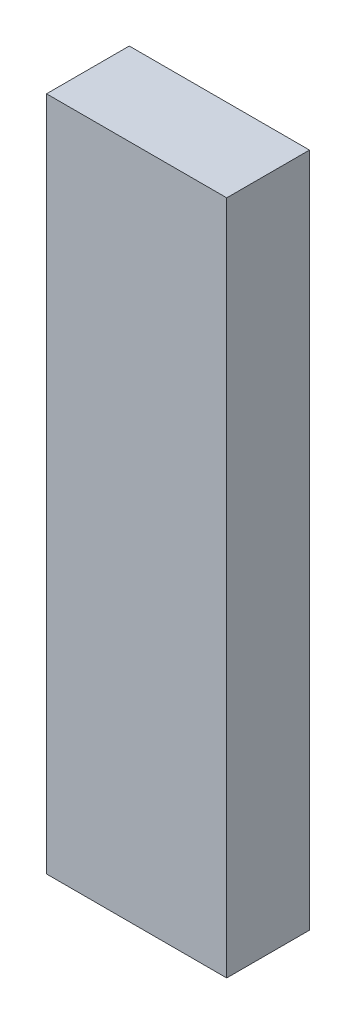
ISO-10303-21;
HEADER;
FILE_DESCRIPTION(('STEP AP214'),'2;1');
FILE_NAME('part.step','',(''),(''),'','','');
FILE_SCHEMA(('AUTOMOTIVE_DESIGN { 1 0 10303 214 1 1 1 1 }'));
ENDSEC;
DATA;
#1=APPLICATION_CONTEXT('core data for automotive mechanical design processes');
#2=APPLICATION_PROTOCOL_DEFINITION('international standard','automotive_design',2000,#1);
#3=PRODUCT_CONTEXT('',#1,'mechanical');
#4=PRODUCT('Part','Part','',(#3));
#5=PRODUCT_RELATED_PRODUCT_CATEGORY('part','',(#4));
#6=PRODUCT_DEFINITION_FORMATION('','',#4);
#7=PRODUCT_DEFINITION_CONTEXT('part definition',#1,'design');
#8=PRODUCT_DEFINITION('design','',#6,#7);
#9=PRODUCT_DEFINITION_SHAPE('','',#8);
#10=(LENGTH_UNIT() NAMED_UNIT(*) SI_UNIT(.MILLI.,.METRE.));
#11=(NAMED_UNIT(*) PLANE_ANGLE_UNIT() SI_UNIT($,.RADIAN.));
#12=(NAMED_UNIT(*) SI_UNIT($,.STERADIAN.) SOLID_ANGLE_UNIT());
#13=UNCERTAINTY_MEASURE_WITH_UNIT(LENGTH_MEASURE(1.E-05),#10,'distance_accuracy_value','');
#14=(GEOMETRIC_REPRESENTATION_CONTEXT(3) GLOBAL_UNCERTAINTY_ASSIGNED_CONTEXT((#13)) GLOBAL_UNIT_ASSIGNED_CONTEXT((#10,
#11,#12)) REPRESENTATION_CONTEXT('',''));
#15=CARTESIAN_POINT('',(0.,0.,0.));
#16=DIRECTION('',(0.,0.,1.));
#17=DIRECTION('',(1.,0.,0.));
#18=AXIS2_PLACEMENT_3D('',#15,#16,#17);
#19=CARTESIAN_POINT('',(0.76183998,-2.8575,0.));
#20=DIRECTION('',(0.,-1.,0.));
#21=DIRECTION('',(0.,0.,-1.));
#22=AXIS2_PLACEMENT_3D('',#19,#20,#21);
#23=PLANE('',#22);
#24=DIRECTION('',(0.,0.,1.));
#25=VECTOR('',#24,1.);
#26=CARTESIAN_POINT('',(0.76183998,-2.8575,0.));
#27=LINE('',#26,#25);
#28=CARTESIAN_POINT('',(0.76183998,-2.8575,0.));
#29=VERTEX_POINT('',#28);
#30=CARTESIAN_POINT('',(0.76183998,-2.8575,0.6999986));
#31=VERTEX_POINT('',#30);
#32=EDGE_CURVE('E11',#29,#31,#27,.T.);
#33=ORIENTED_EDGE('',*,*,#32,.T.);
#34=DIRECTION('',(-1.,0.,0.));
#35=VECTOR('',#34,1.);
#36=CARTESIAN_POINT('',(0.76183998,-2.8575,0.6999986));
#37=LINE('',#36,#35);
#38=CARTESIAN_POINT('',(-0.76216002,-2.8575,0.6999986));
#39=VERTEX_POINT('',#38);
#40=EDGE_CURVE('E28',#31,#39,#37,.T.);
#41=ORIENTED_EDGE('',*,*,#40,.T.);
#42=DIRECTION('',(0.,0.,1.));
#43=VECTOR('',#42,1.);
#44=CARTESIAN_POINT('',(-0.76216002,-2.8575,0.));
#45=LINE('',#44,#43);
#46=CARTESIAN_POINT('',(-0.76216002,-2.8575,0.));
#47=VERTEX_POINT('',#46);
#48=EDGE_CURVE('E90',#47,#39,#45,.T.);
#49=ORIENTED_EDGE('',*,*,#48,.F.);
#50=DIRECTION('',(-1.,0.,0.));
#51=VECTOR('',#50,1.);
#52=CARTESIAN_POINT('',(0.76183998,-2.8575,0.));
#53=LINE('',#52,#51);
#54=EDGE_CURVE('E21',#29,#47,#53,.T.);
#55=ORIENTED_EDGE('',*,*,#54,.F.);
#56=EDGE_LOOP('',(#33,#41,#49,#55));
#57=FACE_BOUND('',#56,.T.);
#58=ADVANCED_FACE('F17',(#57),#23,.T.);
#59=CARTESIAN_POINT('',(-0.76216002,-2.8575,0.));
#60=DIRECTION('',(-1.,0.,0.));
#61=DIRECTION('',(0.,0.,1.));
#62=AXIS2_PLACEMENT_3D('',#59,#60,#61);
#63=PLANE('',#62);
#64=ORIENTED_EDGE('',*,*,#48,.T.);
#65=DIRECTION('',(0.,1.,0.));
#66=VECTOR('',#65,1.);
#67=CARTESIAN_POINT('',(-0.76216002,-2.8575,0.6999986));
#68=LINE('',#67,#66);
#69=CARTESIAN_POINT('',(-0.76216002,2.8575,0.6999986));
#70=VERTEX_POINT('',#69);
#71=EDGE_CURVE('E94',#39,#70,#68,.T.);
#72=ORIENTED_EDGE('',*,*,#71,.T.);
#73=DIRECTION('',(0.,0.,1.));
#74=VECTOR('',#73,1.);
#75=CARTESIAN_POINT('',(-0.76216002,2.8575,0.));
#76=LINE('',#75,#74);
#77=CARTESIAN_POINT('',(-0.76216002,2.8575,0.));
#78=VERTEX_POINT('',#77);
#79=EDGE_CURVE('E97',#78,#70,#76,.T.);
#80=ORIENTED_EDGE('',*,*,#79,.F.);
#81=DIRECTION('',(0.,1.,0.));
#82=VECTOR('',#81,1.);
#83=CARTESIAN_POINT('',(-0.76216002,-2.8575,0.));
#84=LINE('',#83,#82);
#85=EDGE_CURVE('E77',#47,#78,#84,.T.);
#86=ORIENTED_EDGE('',*,*,#85,.F.);
#87=EDGE_LOOP('',(#64,#72,#80,#86));
#88=FACE_BOUND('',#87,.T.);
#89=ADVANCED_FACE('F96',(#88),#63,.T.);
#90=CARTESIAN_POINT('',(-0.76216002,2.8575,0.));
#91=DIRECTION('',(0.,1.,0.));
#92=DIRECTION('',(1.,0.,0.));
#93=AXIS2_PLACEMENT_3D('',#90,#91,#92);
#94=PLANE('',#93);
#95=ORIENTED_EDGE('',*,*,#79,.T.);
#96=DIRECTION('',(1.,0.,0.));
#97=VECTOR('',#96,1.);
#98=CARTESIAN_POINT('',(-0.76216002,2.8575,0.6999986));
#99=LINE('',#98,#97);
#100=CARTESIAN_POINT('',(0.76216256,2.8575,0.6999986));
#101=VERTEX_POINT('',#100);
#102=EDGE_CURVE('E104',#70,#101,#99,.T.);
#103=ORIENTED_EDGE('',*,*,#102,.T.);
#104=DIRECTION('',(0.,0.,1.));
#105=VECTOR('',#104,1.);
#106=CARTESIAN_POINT('',(0.76216256,2.8575,0.));
#107=LINE('',#106,#105);
#108=CARTESIAN_POINT('',(0.76216256,2.8575,0.));
#109=VERTEX_POINT('',#108);
#110=EDGE_CURVE('E70',#109,#101,#107,.T.);
#111=ORIENTED_EDGE('',*,*,#110,.F.);
#112=DIRECTION('',(1.,0.,0.));
#113=VECTOR('',#112,1.);
#114=CARTESIAN_POINT('',(-0.76216002,2.8575,0.));
#115=LINE('',#114,#113);
#116=EDGE_CURVE('E62',#78,#109,#115,.T.);
#117=ORIENTED_EDGE('',*,*,#116,.F.);
#118=EDGE_LOOP('',(#95,#103,#111,#117));
#119=FACE_BOUND('',#118,.T.);
#120=ADVANCED_FACE('F19',(#119),#94,.T.);
#121=CARTESIAN_POINT('',(0.76216256,2.8575,0.));
#122=DIRECTION('',(0.999999998407012,-5.64444443574407E-05,0.));
#123=DIRECTION('',(0.,0.,-1.));
#124=AXIS2_PLACEMENT_3D('',#121,#122,#123);
#125=PLANE('',#124);
#126=ORIENTED_EDGE('',*,*,#110,.T.);
#127=DIRECTION('',(-5.64444443574407E-05,-0.999999998407012,0.));
#128=VECTOR('',#127,1.);
#129=CARTESIAN_POINT('',(0.76216256,2.8575,0.6999986));
#130=LINE('',#129,#128);
#131=EDGE_CURVE('E89',#101,#31,#130,.T.);
#132=ORIENTED_EDGE('',*,*,#131,.T.);
#133=ORIENTED_EDGE('',*,*,#32,.F.);
#134=DIRECTION('',(-5.64444443574407E-05,-0.999999998407012,0.));
#135=VECTOR('',#134,1.);
#136=CARTESIAN_POINT('',(0.76216256,2.8575,0.));
#137=LINE('',#136,#135);
#138=EDGE_CURVE('E87',#109,#29,#137,.T.);
#139=ORIENTED_EDGE('',*,*,#138,.F.);
#140=EDGE_LOOP('',(#126,#132,#133,#139));
#141=FACE_BOUND('',#140,.T.);
#142=ADVANCED_FACE('F118',(#141),#125,.T.);
#143=CARTESIAN_POINT('',(0.76183998,-2.8575,0.));
#144=DIRECTION('',(0.,0.,1.));
#145=DIRECTION('',(1.,0.,0.));
#146=AXIS2_PLACEMENT_3D('',#143,#144,#145);
#147=PLANE('',#146);
#148=ORIENTED_EDGE('',*,*,#54,.T.);
#149=ORIENTED_EDGE('',*,*,#85,.T.);
#150=ORIENTED_EDGE('',*,*,#116,.T.);
#151=ORIENTED_EDGE('',*,*,#138,.T.);
#152=EDGE_LOOP('',(#148,#149,#150,#151));
#153=FACE_BOUND('',#152,.T.);
#154=ADVANCED_FACE('F86',(#153),#147,.F.);
#155=CARTESIAN_POINT('',(0.76183998,-2.8575,0.6999986));
#156=DIRECTION('',(0.,0.,1.));
#157=DIRECTION('',(1.,0.,0.));
#158=AXIS2_PLACEMENT_3D('',#155,#156,#157);
#159=PLANE('',#158);
#160=ORIENTED_EDGE('',*,*,#131,.F.);
#161=ORIENTED_EDGE('',*,*,#102,.F.);
#162=ORIENTED_EDGE('',*,*,#71,.F.);
#163=ORIENTED_EDGE('',*,*,#40,.F.);
#164=EDGE_LOOP('',(#160,#161,#162,#163));
#165=FACE_BOUND('',#164,.T.);
#166=ADVANCED_FACE('F120',(#165),#159,.T.);
#167=CLOSED_SHELL('',(#58,#89,#120,#142,#154,#166));
#168=MANIFOLD_SOLID_BREP('B1',#167);
#169=ADVANCED_BREP_SHAPE_REPRESENTATION('',(#18,#168),#14);
#170=SHAPE_DEFINITION_REPRESENTATION(#9,#169);
ENDSEC;
END-ISO-10303-21;
